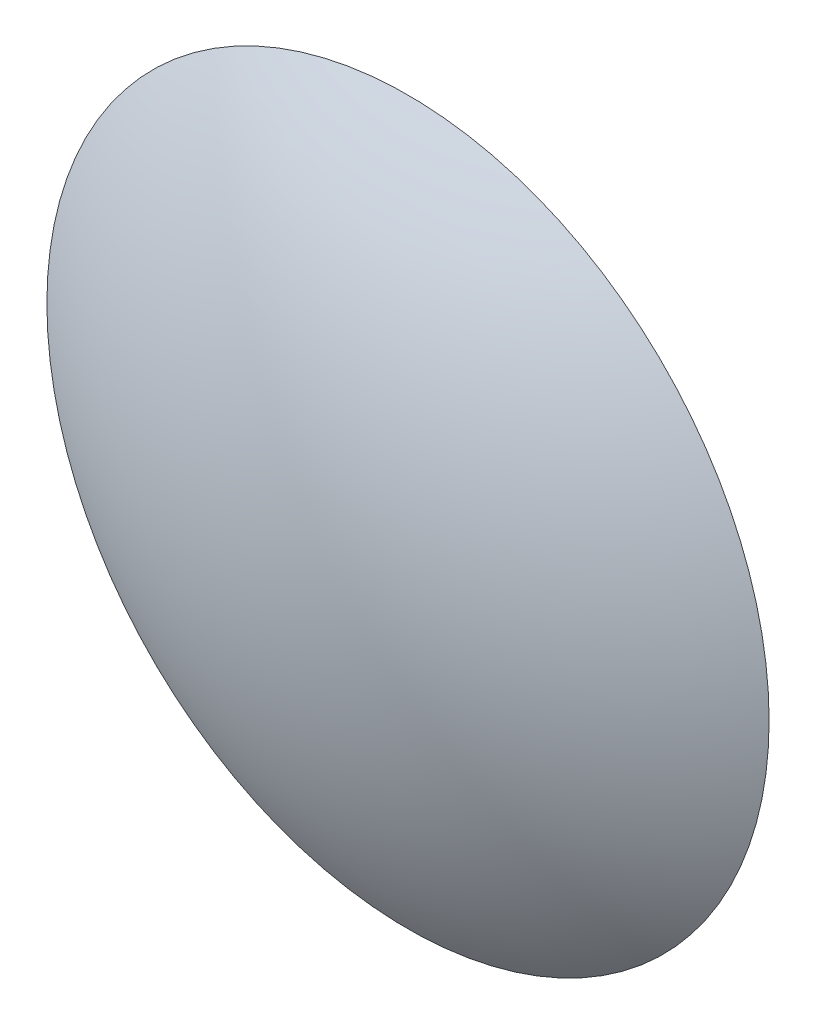
ISO-10303-21;
HEADER;
FILE_DESCRIPTION(('STEP AP214'),'2;1');
FILE_NAME('part.step','',(''),(''),'','','');
FILE_SCHEMA(('AUTOMOTIVE_DESIGN { 1 0 10303 214 1 1 1 1 }'));
ENDSEC;
DATA;
#1=APPLICATION_CONTEXT('core data for automotive mechanical design processes');
#2=APPLICATION_PROTOCOL_DEFINITION('international standard','automotive_design',2000,#1);
#3=PRODUCT_CONTEXT('',#1,'mechanical');
#4=PRODUCT('Part','Part','',(#3));
#5=PRODUCT_RELATED_PRODUCT_CATEGORY('part','',(#4));
#6=PRODUCT_DEFINITION_FORMATION('','',#4);
#7=PRODUCT_DEFINITION_CONTEXT('part definition',#1,'design');
#8=PRODUCT_DEFINITION('design','',#6,#7);
#9=PRODUCT_DEFINITION_SHAPE('','',#8);
#10=(LENGTH_UNIT() NAMED_UNIT(*) SI_UNIT(.MILLI.,.METRE.));
#11=(NAMED_UNIT(*) PLANE_ANGLE_UNIT() SI_UNIT($,.RADIAN.));
#12=(NAMED_UNIT(*) SI_UNIT($,.STERADIAN.) SOLID_ANGLE_UNIT());
#13=UNCERTAINTY_MEASURE_WITH_UNIT(LENGTH_MEASURE(1.E-05),#10,'distance_accuracy_value','');
#14=(GEOMETRIC_REPRESENTATION_CONTEXT(3) GLOBAL_UNCERTAINTY_ASSIGNED_CONTEXT((#13)) GLOBAL_UNIT_ASSIGNED_CONTEXT((#10,
#11,#12)) REPRESENTATION_CONTEXT('',''));
#15=CARTESIAN_POINT('',(0.,0.,0.));
#16=DIRECTION('',(0.,0.,1.));
#17=DIRECTION('',(1.,0.,0.));
#18=AXIS2_PLACEMENT_3D('',#15,#16,#17);
#19=CARTESIAN_POINT('',(0.,0.,-0.454384854758136));
#20=DIRECTION('',(0.,0.,1.));
#21=DIRECTION('',(1.,0.,0.));
#22=AXIS2_PLACEMENT_3D('',#19,#20,#21);
#23=SPHERICAL_SURFACE('',#22,0.769384854758136);
#24=CARTESIAN_POINT('',(0.,0.,0.186963767078068));
#25=DIRECTION('',(0.,0.,1.));
#26=DIRECTION('',(1.,0.,0.));
#27=AXIS2_PLACEMENT_3D('',#24,#25,#26);
#28=CIRCLE('',#27,0.425);
#29=CARTESIAN_POINT('',(0.425,0.,0.186963767078068));
#30=VERTEX_POINT('',#29);
#31=CARTESIAN_POINT('',(-0.425,0.,0.186963767078068));
#32=VERTEX_POINT('',#31);
#33=EDGE_CURVE('E11',#30,#32,#28,.T.);
#34=ORIENTED_EDGE('',*,*,#33,.T.);
#35=CARTESIAN_POINT('',(0.,0.,-0.454384854758136));
#36=DIRECTION('',(0.,-1.,0.));
#37=DIRECTION('',(-1.,0.,0.));
#38=AXIS2_PLACEMENT_3D('',#35,#36,#37);
#39=CIRCLE('',#38,0.769384854758136);
#40=CARTESIAN_POINT('',(0.,0.,0.315));
#41=VERTEX_POINT('',#40);
#42=EDGE_CURVE('E24',#41,#32,#39,.T.);
#43=ORIENTED_EDGE('',*,*,#42,.F.);
#44=ORIENTED_EDGE('',*,*,#42,.T.);
#45=CARTESIAN_POINT('',(0.,0.,0.186963767078068));
#46=DIRECTION('',(0.,0.,1.));
#47=DIRECTION('',(1.,0.,0.));
#48=AXIS2_PLACEMENT_3D('',#45,#46,#47);
#49=CIRCLE('',#48,0.425);
#50=EDGE_CURVE('E35',#32,#30,#49,.T.);
#51=ORIENTED_EDGE('',*,*,#50,.T.);
#52=EDGE_LOOP('',(#34,#43,#44,#51));
#53=FACE_BOUND('',#52,.T.);
#54=ADVANCED_FACE('F17',(#53),#23,.T.);
#55=CARTESIAN_POINT('',(0.425,0.,0.186963767078068));
#56=DIRECTION('',(0.,0.,-1.));
#57=DIRECTION('',(-1.,0.,0.));
#58=AXIS2_PLACEMENT_3D('',#55,#56,#57);
#59=PLANE('',#58);
#60=ORIENTED_EDGE('',*,*,#33,.F.);
#61=ORIENTED_EDGE('',*,*,#50,.F.);
#62=EDGE_LOOP('',(#60,#61));
#63=FACE_BOUND('',#62,.T.);
#64=ADVANCED_FACE('F37',(#63),#59,.T.);
#65=CLOSED_SHELL('',(#54,#64));
#66=MANIFOLD_SOLID_BREP('B1',#65);
#67=ADVANCED_BREP_SHAPE_REPRESENTATION('',(#18,#66),#14);
#68=SHAPE_DEFINITION_REPRESENTATION(#9,#67);
ENDSEC;
END-ISO-10303-21;
